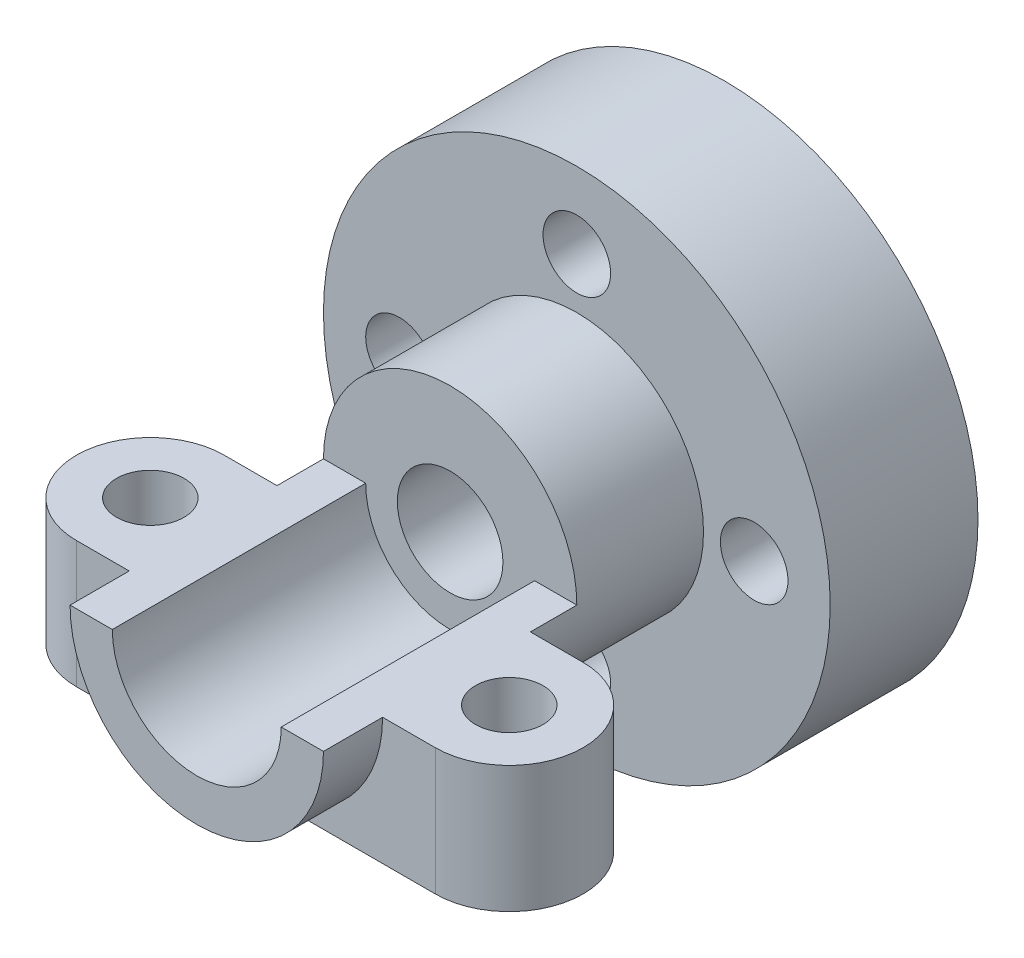
ISO-10303-21;
HEADER;
FILE_DESCRIPTION(('STEP AP214'),'2;1');
FILE_NAME('part.step','',(''),(''),'','','');
FILE_SCHEMA(('AUTOMOTIVE_DESIGN { 1 0 10303 214 1 1 1 1 }'));
ENDSEC;
DATA;
#1=APPLICATION_CONTEXT('core data for automotive mechanical design processes');
#2=APPLICATION_PROTOCOL_DEFINITION('international standard','automotive_design',2000,#1);
#3=PRODUCT_CONTEXT('',#1,'mechanical');
#4=PRODUCT('Part','Part','',(#3));
#5=PRODUCT_RELATED_PRODUCT_CATEGORY('part','',(#4));
#6=PRODUCT_DEFINITION_FORMATION('','',#4);
#7=PRODUCT_DEFINITION_CONTEXT('part definition',#1,'design');
#8=PRODUCT_DEFINITION('design','',#6,#7);
#9=PRODUCT_DEFINITION_SHAPE('','',#8);
#10=(LENGTH_UNIT() NAMED_UNIT(*) SI_UNIT(.MILLI.,.METRE.));
#11=(NAMED_UNIT(*) PLANE_ANGLE_UNIT() SI_UNIT($,.RADIAN.));
#12=(NAMED_UNIT(*) SI_UNIT($,.STERADIAN.) SOLID_ANGLE_UNIT());
#13=UNCERTAINTY_MEASURE_WITH_UNIT(LENGTH_MEASURE(1.E-05),#10,'distance_accuracy_value','');
#14=(GEOMETRIC_REPRESENTATION_CONTEXT(3) GLOBAL_UNCERTAINTY_ASSIGNED_CONTEXT((#13)) GLOBAL_UNIT_ASSIGNED_CONTEXT((#10,
#11,#12)) REPRESENTATION_CONTEXT('',''));
#15=CARTESIAN_POINT('',(0.,0.,0.));
#16=DIRECTION('',(0.,0.,1.));
#17=DIRECTION('',(1.,0.,0.));
#18=AXIS2_PLACEMENT_3D('',#15,#16,#17);
#19=CARTESIAN_POINT('',(0.,0.,65.));
#20=DIRECTION('',(0.,0.,-1.));
#21=DIRECTION('',(-1.,0.,0.));
#22=AXIS2_PLACEMENT_3D('',#19,#20,#21);
#23=CYLINDRICAL_SURFACE('',#22,12.5);
#24=CARTESIAN_POINT('',(0.,0.,65.));
#25=DIRECTION('',(0.,0.,1.));
#26=DIRECTION('',(1.,0.,0.));
#27=AXIS2_PLACEMENT_3D('',#24,#25,#26);
#28=CIRCLE('',#27,12.5);
#29=CARTESIAN_POINT('',(12.5,0.,65.));
#30=VERTEX_POINT('',#29);
#31=EDGE_CURVE('E218',#30,#30,#28,.T.);
#32=ORIENTED_EDGE('',*,*,#31,.T.);
#33=EDGE_LOOP('',(#32));
#34=FACE_BOUND('',#33,.T.);
#35=CARTESIAN_POINT('',(0.,0.,10.));
#36=DIRECTION('',(0.,0.,-1.));
#37=DIRECTION('',(-1.,0.,0.));
#38=AXIS2_PLACEMENT_3D('',#35,#36,#37);
#39=CIRCLE('',#38,12.5);
#40=CARTESIAN_POINT('',(-12.5,0.,10.));
#41=VERTEX_POINT('',#40);
#42=EDGE_CURVE('E308',#41,#41,#39,.T.);
#43=ORIENTED_EDGE('',*,*,#42,.T.);
#44=EDGE_LOOP('',(#43));
#45=FACE_BOUND('',#44,.T.);
#46=ADVANCED_FACE('F41',(#34,#45),#23,.F.);
#47=CARTESIAN_POINT('',(42.,0.,35.));
#48=DIRECTION('',(0.,0.,-1.));
#49=DIRECTION('',(-1.,0.,0.));
#50=AXIS2_PLACEMENT_3D('',#47,#48,#49);
#51=CYLINDRICAL_SURFACE('',#50,7.99999999999999);
#52=CARTESIAN_POINT('',(42.,0.,35.));
#53=DIRECTION('',(0.,0.,1.));
#54=DIRECTION('',(1.,0.,0.));
#55=AXIS2_PLACEMENT_3D('',#52,#53,#54);
#56=CIRCLE('',#55,7.99999999999999);
#57=CARTESIAN_POINT('',(50.,0.,35.));
#58=VERTEX_POINT('',#57);
#59=EDGE_CURVE('E206',#58,#58,#56,.T.);
#60=ORIENTED_EDGE('',*,*,#59,.T.);
#61=EDGE_LOOP('',(#60));
#62=FACE_BOUND('',#61,.T.);
#63=CARTESIAN_POINT('',(42.,0.,10.));
#64=DIRECTION('',(0.,0.,-1.));
#65=DIRECTION('',(-1.,0.,0.));
#66=AXIS2_PLACEMENT_3D('',#63,#64,#65);
#67=CIRCLE('',#66,7.99999999999999);
#68=CARTESIAN_POINT('',(34.,0.,10.));
#69=VERTEX_POINT('',#68);
#70=EDGE_CURVE('E312',#69,#69,#67,.T.);
#71=ORIENTED_EDGE('',*,*,#70,.T.);
#72=EDGE_LOOP('',(#71));
#73=FACE_BOUND('',#72,.T.);
#74=ADVANCED_FACE('F353',(#62,#73),#51,.F.);
#75=CARTESIAN_POINT('',(0.,-42.,35.));
#76=DIRECTION('',(0.,0.,-1.));
#77=DIRECTION('',(-1.,0.,0.));
#78=AXIS2_PLACEMENT_3D('',#75,#76,#77);
#79=CYLINDRICAL_SURFACE('',#78,8.);
#80=CARTESIAN_POINT('',(0.,-42.,35.));
#81=DIRECTION('',(0.,0.,1.));
#82=DIRECTION('',(1.,0.,0.));
#83=AXIS2_PLACEMENT_3D('',#80,#81,#82);
#84=CIRCLE('',#83,8.);
#85=CARTESIAN_POINT('',(8.,-42.,35.));
#86=VERTEX_POINT('',#85);
#87=EDGE_CURVE('E202',#86,#86,#84,.T.);
#88=ORIENTED_EDGE('',*,*,#87,.T.);
#89=EDGE_LOOP('',(#88));
#90=FACE_BOUND('',#89,.T.);
#91=CARTESIAN_POINT('',(0.,-42.,10.));
#92=DIRECTION('',(0.,0.,-1.));
#93=DIRECTION('',(-1.,0.,0.));
#94=AXIS2_PLACEMENT_3D('',#91,#92,#93);
#95=CIRCLE('',#94,8.);
#96=CARTESIAN_POINT('',(-7.99999999999999,-42.,10.));
#97=VERTEX_POINT('',#96);
#98=EDGE_CURVE('E316',#97,#97,#95,.T.);
#99=ORIENTED_EDGE('',*,*,#98,.T.);
#100=EDGE_LOOP('',(#99));
#101=FACE_BOUND('',#100,.T.);
#102=ADVANCED_FACE('F359',(#90,#101),#79,.F.);
#103=CARTESIAN_POINT('',(-42.,0.,35.));
#104=DIRECTION('',(0.,0.,-1.));
#105=DIRECTION('',(-1.,0.,0.));
#106=AXIS2_PLACEMENT_3D('',#103,#104,#105);
#107=CYLINDRICAL_SURFACE('',#106,7.99999999999998);
#108=CARTESIAN_POINT('',(-42.,0.,35.));
#109=DIRECTION('',(0.,0.,1.));
#110=DIRECTION('',(1.,0.,0.));
#111=AXIS2_PLACEMENT_3D('',#108,#109,#110);
#112=CIRCLE('',#111,7.99999999999998);
#113=CARTESIAN_POINT('',(-34.,0.,35.));
#114=VERTEX_POINT('',#113);
#115=EDGE_CURVE('E198',#114,#114,#112,.T.);
#116=ORIENTED_EDGE('',*,*,#115,.T.);
#117=EDGE_LOOP('',(#116));
#118=FACE_BOUND('',#117,.T.);
#119=CARTESIAN_POINT('',(-42.,0.,10.));
#120=DIRECTION('',(0.,0.,-1.));
#121=DIRECTION('',(-1.,0.,0.));
#122=AXIS2_PLACEMENT_3D('',#119,#120,#121);
#123=CIRCLE('',#122,7.99999999999998);
#124=CARTESIAN_POINT('',(-50.,0.,10.));
#125=VERTEX_POINT('',#124);
#126=EDGE_CURVE('E320',#125,#125,#123,.T.);
#127=ORIENTED_EDGE('',*,*,#126,.T.);
#128=EDGE_LOOP('',(#127));
#129=FACE_BOUND('',#128,.T.);
#130=ADVANCED_FACE('F437',(#118,#129),#107,.F.);
#131=CARTESIAN_POINT('',(0.,42.,35.));
#132=DIRECTION('',(0.,0.,-1.));
#133=DIRECTION('',(-1.,0.,0.));
#134=AXIS2_PLACEMENT_3D('',#131,#132,#133);
#135=CYLINDRICAL_SURFACE('',#134,8.);
#136=CARTESIAN_POINT('',(0.,42.,35.));
#137=DIRECTION('',(0.,0.,1.));
#138=DIRECTION('',(1.,0.,0.));
#139=AXIS2_PLACEMENT_3D('',#136,#137,#138);
#140=CIRCLE('',#139,8.);
#141=CARTESIAN_POINT('',(7.99999999999999,42.,35.));
#142=VERTEX_POINT('',#141);
#143=EDGE_CURVE('E194',#142,#142,#140,.T.);
#144=ORIENTED_EDGE('',*,*,#143,.T.);
#145=EDGE_LOOP('',(#144));
#146=FACE_BOUND('',#145,.T.);
#147=CARTESIAN_POINT('',(0.,42.,10.));
#148=DIRECTION('',(0.,0.,-1.));
#149=DIRECTION('',(-1.,0.,0.));
#150=AXIS2_PLACEMENT_3D('',#147,#148,#149);
#151=CIRCLE('',#150,8.);
#152=CARTESIAN_POINT('',(-8.00000000000001,42.,10.));
#153=VERTEX_POINT('',#152);
#154=EDGE_CURVE('E46',#153,#153,#151,.T.);
#155=ORIENTED_EDGE('',*,*,#154,.T.);
#156=EDGE_LOOP('',(#155));
#157=FACE_BOUND('',#156,.T.);
#158=ADVANCED_FACE('F337',(#146,#157),#135,.F.);
#159=CARTESIAN_POINT('',(0.,0.,125.));
#160=DIRECTION('',(0.,-1.,0.));
#161=DIRECTION('',(1.,0.,0.));
#162=AXIS2_PLACEMENT_3D('',#159,#160,#161);
#163=PLANE('',#162);
#164=DIRECTION('',(1.,0.,0.));
#165=VECTOR('',#164,1.);
#166=CARTESIAN_POINT('',(-30.,0.,76.));
#167=LINE('',#166,#165);
#168=CARTESIAN_POINT('',(-42.5,0.,76.));
#169=VERTEX_POINT('',#168);
#170=CARTESIAN_POINT('',(-30.,0.,76.));
#171=VERTEX_POINT('',#170);
#172=EDGE_CURVE('E169',#169,#171,#167,.T.);
#173=ORIENTED_EDGE('',*,*,#172,.F.);
#174=CARTESIAN_POINT('',(-42.5,0.,93.5));
#175=DIRECTION('',(0.,-1.,0.));
#176=DIRECTION('',(1.,0.,0.));
#177=AXIS2_PLACEMENT_3D('',#174,#175,#176);
#178=CIRCLE('',#177,17.5);
#179=CARTESIAN_POINT('',(-42.5,0.,111.));
#180=VERTEX_POINT('',#179);
#181=EDGE_CURVE('E52',#169,#180,#178,.F.);
#182=ORIENTED_EDGE('',*,*,#181,.T.);
#183=DIRECTION('',(1.,0.,0.));
#184=VECTOR('',#183,1.);
#185=CARTESIAN_POINT('',(-30.,0.,111.));
#186=LINE('',#185,#184);
#187=CARTESIAN_POINT('',(-30.,0.,111.));
#188=VERTEX_POINT('',#187);
#189=EDGE_CURVE('E157',#180,#188,#186,.T.);
#190=ORIENTED_EDGE('',*,*,#189,.T.);
#191=DIRECTION('',(0.,0.,-1.));
#192=VECTOR('',#191,1.);
#193=CARTESIAN_POINT('',(-30.,0.,125.));
#194=LINE('',#193,#192);
#195=CARTESIAN_POINT('',(-30.,0.,125.));
#196=VERTEX_POINT('',#195);
#197=EDGE_CURVE('E153',#196,#188,#194,.T.);
#198=ORIENTED_EDGE('',*,*,#197,.F.);
#199=DIRECTION('',(-1.,0.,0.));
#200=VECTOR('',#199,1.);
#201=CARTESIAN_POINT('',(0.,0.,125.));
#202=LINE('',#201,#200);
#203=CARTESIAN_POINT('',(-20.,0.,125.));
#204=VERTEX_POINT('',#203);
#205=EDGE_CURVE('E244',#204,#196,#202,.T.);
#206=ORIENTED_EDGE('',*,*,#205,.F.);
#207=DIRECTION('',(0.,0.,-1.));
#208=VECTOR('',#207,1.);
#209=CARTESIAN_POINT('',(-20.,0.,125.));
#210=LINE('',#209,#208);
#211=CARTESIAN_POINT('',(-20.,0.,65.));
#212=VERTEX_POINT('',#211);
#213=EDGE_CURVE('E265',#204,#212,#210,.T.);
#214=ORIENTED_EDGE('',*,*,#213,.T.);
#215=DIRECTION('',(-1.,0.,0.));
#216=VECTOR('',#215,1.);
#217=CARTESIAN_POINT('',(0.,0.,65.));
#218=LINE('',#217,#216);
#219=CARTESIAN_POINT('',(-30.,0.,65.));
#220=VERTEX_POINT('',#219);
#221=EDGE_CURVE('E225',#212,#220,#218,.T.);
#222=ORIENTED_EDGE('',*,*,#221,.T.);
#223=EDGE_CURVE('E262',#171,#220,#194,.T.);
#224=ORIENTED_EDGE('',*,*,#223,.F.);
#225=EDGE_LOOP('',(#173,#182,#190,#198,#206,#214,#222,#224));
#226=FACE_BOUND('',#225,.T.);
#227=CARTESIAN_POINT('',(-42.5,0.,93.5));
#228=DIRECTION('',(0.,1.,0.));
#229=DIRECTION('',(0.,0.,1.));
#230=AXIS2_PLACEMENT_3D('',#227,#228,#229);
#231=CIRCLE('',#230,7.99999999999999);
#232=CARTESIAN_POINT('',(-42.5,0.,101.5));
#233=VERTEX_POINT('',#232);
#234=EDGE_CURVE('E304',#233,#233,#231,.T.);
#235=ORIENTED_EDGE('',*,*,#234,.F.);
#236=EDGE_LOOP('',(#235));
#237=FACE_BOUND('',#236,.T.);
#238=ADVANCED_FACE('F289',(#226,#237),#163,.F.);
#239=CARTESIAN_POINT('',(-42.5,0.,93.5));
#240=DIRECTION('',(0.,1.,0.));
#241=DIRECTION('',(0.,0.,1.));
#242=AXIS2_PLACEMENT_3D('',#239,#240,#241);
#243=CYLINDRICAL_SURFACE('',#242,17.5);
#244=DIRECTION('',(0.,-1.,0.));
#245=VECTOR('',#244,1.);
#246=CARTESIAN_POINT('',(-42.5,0.,111.));
#247=LINE('',#246,#245);
#248=CARTESIAN_POINT('',(-42.5,-30.,111.));
#249=VERTEX_POINT('',#248);
#250=EDGE_CURVE('E162',#180,#249,#247,.T.);
#251=ORIENTED_EDGE('',*,*,#250,.F.);
#252=ORIENTED_EDGE('',*,*,#181,.F.);
#253=DIRECTION('',(0.,1.,0.));
#254=VECTOR('',#253,1.);
#255=CARTESIAN_POINT('',(-42.5,0.,76.));
#256=LINE('',#255,#254);
#257=CARTESIAN_POINT('',(-42.5,-30.,76.));
#258=VERTEX_POINT('',#257);
#259=EDGE_CURVE('E283',#258,#169,#256,.T.);
#260=ORIENTED_EDGE('',*,*,#259,.F.);
#261=CARTESIAN_POINT('',(-42.5,-30.,93.5));
#262=DIRECTION('',(0.,-1.,0.));
#263=DIRECTION('',(0.,0.,-1.));
#264=AXIS2_PLACEMENT_3D('',#261,#262,#263);
#265=CIRCLE('',#264,17.5);
#266=EDGE_CURVE('E11',#249,#258,#265,.T.);
#267=ORIENTED_EDGE('',*,*,#266,.F.);
#268=EDGE_LOOP('',(#251,#252,#260,#267));
#269=FACE_BOUND('',#268,.T.);
#270=ADVANCED_FACE('F44',(#269),#243,.T.);
#271=CARTESIAN_POINT('',(0.,0.,125.));
#272=DIRECTION('',(0.,0.,-1.));
#273=DIRECTION('',(-1.,0.,0.));
#274=AXIS2_PLACEMENT_3D('',#271,#272,#273);
#275=CYLINDRICAL_SURFACE('',#274,30.);
#276=CARTESIAN_POINT('',(0.,0.,35.));
#277=DIRECTION('',(0.,0.,1.));
#278=DIRECTION('',(1.,0.,0.));
#279=AXIS2_PLACEMENT_3D('',#276,#277,#278);
#280=CIRCLE('',#279,30.);
#281=CARTESIAN_POINT('',(30.,0.,35.));
#282=VERTEX_POINT('',#281);
#283=EDGE_CURVE('E210',#282,#282,#280,.T.);
#284=ORIENTED_EDGE('',*,*,#283,.T.);
#285=EDGE_LOOP('',(#284));
#286=FACE_BOUND('',#285,.T.);
#287=CARTESIAN_POINT('',(0.,0.,76.));
#288=DIRECTION('',(0.,0.,1.));
#289=DIRECTION('',(-1.,0.,0.));
#290=AXIS2_PLACEMENT_3D('',#287,#288,#289);
#291=CIRCLE('',#290,30.);
#292=CARTESIAN_POINT('',(0.,-30.,76.));
#293=VERTEX_POINT('',#292);
#294=EDGE_CURVE('E164',#171,#293,#291,.T.);
#295=ORIENTED_EDGE('',*,*,#294,.F.);
#296=ORIENTED_EDGE('',*,*,#223,.T.);
#297=CARTESIAN_POINT('',(0.,0.,65.));
#298=DIRECTION('',(0.,0.,1.));
#299=DIRECTION('',(1.,0.,0.));
#300=AXIS2_PLACEMENT_3D('',#297,#298,#299);
#301=CIRCLE('',#300,30.);
#302=CARTESIAN_POINT('',(30.,0.,65.));
#303=VERTEX_POINT('',#302);
#304=EDGE_CURVE('E236',#303,#220,#301,.T.);
#305=ORIENTED_EDGE('',*,*,#304,.F.);
#306=DIRECTION('',(0.,0.,-1.));
#307=VECTOR('',#306,1.);
#308=CARTESIAN_POINT('',(30.,0.,125.));
#309=LINE('',#308,#307);
#310=CARTESIAN_POINT('',(30.,0.,76.));
#311=VERTEX_POINT('',#310);
#312=EDGE_CURVE('E258',#311,#303,#309,.T.);
#313=ORIENTED_EDGE('',*,*,#312,.F.);
#314=CARTESIAN_POINT('',(0.,0.,76.));
#315=DIRECTION('',(0.,0.,-1.));
#316=DIRECTION('',(1.,0.,0.));
#317=AXIS2_PLACEMENT_3D('',#314,#315,#316);
#318=CIRCLE('',#317,30.);
#319=EDGE_CURVE('E181',#311,#293,#318,.T.);
#320=ORIENTED_EDGE('',*,*,#319,.T.);
#321=EDGE_LOOP('',(#295,#296,#305,#313,#320));
#322=FACE_BOUND('',#321,.T.);
#323=ADVANCED_FACE('F383',(#286,#322),#275,.T.);
#324=CARTESIAN_POINT('',(42.5,-30.,93.5));
#325=DIRECTION('',(0.,1.,0.));
#326=DIRECTION('',(0.,0.,1.));
#327=AXIS2_PLACEMENT_3D('',#324,#325,#326);
#328=CYLINDRICAL_SURFACE('',#327,17.5);
#329=DIRECTION('',(0.,1.,0.));
#330=VECTOR('',#329,1.);
#331=CARTESIAN_POINT('',(42.5,0.,111.));
#332=LINE('',#331,#330);
#333=CARTESIAN_POINT('',(42.5,-30.,111.));
#334=VERTEX_POINT('',#333);
#335=CARTESIAN_POINT('',(42.5,0.,111.));
#336=VERTEX_POINT('',#335);
#337=EDGE_CURVE('E269',#334,#336,#332,.T.);
#338=ORIENTED_EDGE('',*,*,#337,.F.);
#339=CARTESIAN_POINT('',(42.5,-30.,93.5));
#340=DIRECTION('',(0.,-1.,0.));
#341=DIRECTION('',(0.,0.,-1.));
#342=AXIS2_PLACEMENT_3D('',#339,#340,#341);
#343=CIRCLE('',#342,17.5);
#344=CARTESIAN_POINT('',(42.5,-30.,76.));
#345=VERTEX_POINT('',#344);
#346=EDGE_CURVE('E143',#345,#334,#343,.T.);
#347=ORIENTED_EDGE('',*,*,#346,.F.);
#348=DIRECTION('',(0.,-1.,0.));
#349=VECTOR('',#348,1.);
#350=CARTESIAN_POINT('',(42.5,-30.,76.));
#351=LINE('',#350,#349);
#352=CARTESIAN_POINT('',(42.5,0.,76.));
#353=VERTEX_POINT('',#352);
#354=EDGE_CURVE('E272',#353,#345,#351,.T.);
#355=ORIENTED_EDGE('',*,*,#354,.F.);
#356=CARTESIAN_POINT('',(42.5,0.,93.5));
#357=DIRECTION('',(0.,1.,0.));
#358=DIRECTION('',(-1.,0.,0.));
#359=AXIS2_PLACEMENT_3D('',#356,#357,#358);
#360=CIRCLE('',#359,17.5);
#361=EDGE_CURVE('E278',#336,#353,#360,.T.);
#362=ORIENTED_EDGE('',*,*,#361,.F.);
#363=EDGE_LOOP('',(#338,#347,#355,#362));
#364=FACE_BOUND('',#363,.T.);
#365=ADVANCED_FACE('F382',(#364),#328,.T.);
#366=ORIENTED_EDGE('',*,*,#197,.T.);
#367=CARTESIAN_POINT('',(0.,0.,111.));
#368=DIRECTION('',(0.,0.,1.));
#369=DIRECTION('',(-1.,0.,0.));
#370=AXIS2_PLACEMENT_3D('',#367,#368,#369);
#371=CIRCLE('',#370,30.);
#372=CARTESIAN_POINT('',(0.,-30.,111.));
#373=VERTEX_POINT('',#372);
#374=EDGE_CURVE('E149',#188,#373,#371,.T.);
#375=ORIENTED_EDGE('',*,*,#374,.T.);
#376=CARTESIAN_POINT('',(0.,0.,111.));
#377=DIRECTION('',(0.,0.,-1.));
#378=DIRECTION('',(1.,0.,0.));
#379=AXIS2_PLACEMENT_3D('',#376,#377,#378);
#380=CIRCLE('',#379,30.);
#381=CARTESIAN_POINT('',(30.,0.,111.));
#382=VERTEX_POINT('',#381);
#383=EDGE_CURVE('E125',#382,#373,#380,.T.);
#384=ORIENTED_EDGE('',*,*,#383,.F.);
#385=CARTESIAN_POINT('',(30.,0.,125.));
#386=VERTEX_POINT('',#385);
#387=EDGE_CURVE('E259',#386,#382,#309,.T.);
#388=ORIENTED_EDGE('',*,*,#387,.F.);
#389=CARTESIAN_POINT('',(0.,0.,125.));
#390=DIRECTION('',(0.,0.,1.));
#391=DIRECTION('',(1.,0.,0.));
#392=AXIS2_PLACEMENT_3D('',#389,#390,#391);
#393=CIRCLE('',#392,30.);
#394=EDGE_CURVE('E247',#196,#386,#393,.T.);
#395=ORIENTED_EDGE('',*,*,#394,.F.);
#396=EDGE_LOOP('',(#366,#375,#384,#388,#395));
#397=FACE_BOUND('',#396,.T.);
#398=ADVANCED_FACE('F150',(#397),#275,.T.);
#399=CARTESIAN_POINT('',(0.,0.,125.));
#400=DIRECTION('',(0.,0.,-1.));
#401=DIRECTION('',(-1.,0.,0.));
#402=AXIS2_PLACEMENT_3D('',#399,#400,#401);
#403=CYLINDRICAL_SURFACE('',#402,20.);
#404=CARTESIAN_POINT('',(0.,0.,65.));
#405=DIRECTION('',(0.,0.,1.));
#406=DIRECTION('',(1.,0.,0.));
#407=AXIS2_PLACEMENT_3D('',#404,#405,#406);
#408=CIRCLE('',#407,20.);
#409=CARTESIAN_POINT('',(20.,0.,65.));
#410=VERTEX_POINT('',#409);
#411=EDGE_CURVE('E229',#212,#410,#408,.T.);
#412=ORIENTED_EDGE('',*,*,#411,.F.);
#413=ORIENTED_EDGE('',*,*,#213,.F.);
#414=CARTESIAN_POINT('',(0.,0.,125.));
#415=DIRECTION('',(0.,0.,1.));
#416=DIRECTION('',(1.,0.,0.));
#417=AXIS2_PLACEMENT_3D('',#414,#415,#416);
#418=CIRCLE('',#417,20.);
#419=CARTESIAN_POINT('',(20.,0.,125.));
#420=VERTEX_POINT('',#419);
#421=EDGE_CURVE('E240',#204,#420,#418,.T.);
#422=ORIENTED_EDGE('',*,*,#421,.T.);
#423=DIRECTION('',(0.,0.,-1.));
#424=VECTOR('',#423,1.);
#425=CARTESIAN_POINT('',(20.,0.,125.));
#426=LINE('',#425,#424);
#427=EDGE_CURVE('E254',#420,#410,#426,.T.);
#428=ORIENTED_EDGE('',*,*,#427,.T.);
#429=EDGE_LOOP('',(#412,#413,#422,#428));
#430=FACE_BOUND('',#429,.T.);
#431=ADVANCED_FACE('F378',(#430),#403,.F.);
#432=CARTESIAN_POINT('',(0.,0.,125.));
#433=DIRECTION('',(0.,1.,0.));
#434=DIRECTION('',(-1.,0.,0.));
#435=AXIS2_PLACEMENT_3D('',#432,#433,#434);
#436=PLANE('',#435);
#437=CARTESIAN_POINT('',(42.5,0.,93.5));
#438=DIRECTION('',(0.,1.,0.));
#439=DIRECTION('',(0.,0.,1.));
#440=AXIS2_PLACEMENT_3D('',#437,#438,#439);
#441=CIRCLE('',#440,7.99999999999999);
#442=CARTESIAN_POINT('',(42.5,0.,101.5));
#443=VERTEX_POINT('',#442);
#444=EDGE_CURVE('E173',#443,#443,#441,.T.);
#445=ORIENTED_EDGE('',*,*,#444,.F.);
#446=EDGE_LOOP('',(#445));
#447=FACE_BOUND('',#446,.T.);
#448=DIRECTION('',(-1.,0.,0.));
#449=VECTOR('',#448,1.);
#450=CARTESIAN_POINT('',(30.,0.,111.));
#451=LINE('',#450,#449);
#452=EDGE_CURVE('E131',#336,#382,#451,.T.);
#453=ORIENTED_EDGE('',*,*,#452,.F.);
#454=ORIENTED_EDGE('',*,*,#361,.T.);
#455=DIRECTION('',(-1.,0.,0.));
#456=VECTOR('',#455,1.);
#457=CARTESIAN_POINT('',(30.,0.,76.));
#458=LINE('',#457,#456);
#459=EDGE_CURVE('E188',#353,#311,#458,.T.);
#460=ORIENTED_EDGE('',*,*,#459,.T.);
#461=ORIENTED_EDGE('',*,*,#312,.T.);
#462=DIRECTION('',(1.,0.,0.));
#463=VECTOR('',#462,1.);
#464=CARTESIAN_POINT('',(0.,0.,65.));
#465=LINE('',#464,#463);
#466=EDGE_CURVE('E232',#410,#303,#465,.T.);
#467=ORIENTED_EDGE('',*,*,#466,.F.);
#468=ORIENTED_EDGE('',*,*,#427,.F.);
#469=DIRECTION('',(1.,0.,0.));
#470=VECTOR('',#469,1.);
#471=CARTESIAN_POINT('',(0.,0.,125.));
#472=LINE('',#471,#470);
#473=EDGE_CURVE('E250',#420,#386,#472,.T.);
#474=ORIENTED_EDGE('',*,*,#473,.T.);
#475=ORIENTED_EDGE('',*,*,#387,.T.);
#476=EDGE_LOOP('',(#453,#454,#460,#461,#467,#468,#474,#475));
#477=FACE_BOUND('',#476,.T.);
#478=ADVANCED_FACE('F371',(#447,#477),#436,.T.);
#479=CARTESIAN_POINT('',(0.,0.,125.));
#480=DIRECTION('',(0.,0.,1.));
#481=DIRECTION('',(1.,0.,0.));
#482=AXIS2_PLACEMENT_3D('',#479,#480,#481);
#483=PLANE('',#482);
#484=ORIENTED_EDGE('',*,*,#421,.F.);
#485=ORIENTED_EDGE('',*,*,#205,.T.);
#486=ORIENTED_EDGE('',*,*,#394,.T.);
#487=ORIENTED_EDGE('',*,*,#473,.F.);
#488=EDGE_LOOP('',(#484,#485,#486,#487));
#489=FACE_BOUND('',#488,.T.);
#490=ADVANCED_FACE('F367',(#489),#483,.T.);
#491=CARTESIAN_POINT('',(0.,0.,0.));
#492=DIRECTION('',(0.,0.,1.));
#493=DIRECTION('',(1.,0.,0.));
#494=AXIS2_PLACEMENT_3D('',#491,#492,#493);
#495=PLANE('',#494);
#496=CARTESIAN_POINT('',(0.,0.,0.));
#497=DIRECTION('',(0.,0.,-1.));
#498=DIRECTION('',(-1.,0.,0.));
#499=AXIS2_PLACEMENT_3D('',#496,#497,#498);
#500=CIRCLE('',#499,53.7903773295249);
#501=CARTESIAN_POINT('',(-53.7903773295249,0.,0.));
#502=VERTEX_POINT('',#501);
#503=EDGE_CURVE('E324',#502,#502,#500,.T.);
#504=ORIENTED_EDGE('',*,*,#503,.F.);
#505=EDGE_LOOP('',(#504));
#506=FACE_BOUND('',#505,.T.);
#507=CARTESIAN_POINT('',(0.,0.,0.));
#508=DIRECTION('',(0.,0.,1.));
#509=DIRECTION('',(1.,0.,0.));
#510=AXIS2_PLACEMENT_3D('',#507,#508,#509);
#511=CIRCLE('',#510,60.);
#512=CARTESIAN_POINT('',(60.,0.,0.));
#513=VERTEX_POINT('',#512);
#514=EDGE_CURVE('E190',#513,#513,#511,.T.);
#515=ORIENTED_EDGE('',*,*,#514,.F.);
#516=EDGE_LOOP('',(#515));
#517=FACE_BOUND('',#516,.T.);
#518=ADVANCED_FACE('F370',(#506,#517),#495,.F.);
#519=CARTESIAN_POINT('',(0.,0.,65.));
#520=DIRECTION('',(0.,0.,1.));
#521=DIRECTION('',(1.,0.,0.));
#522=AXIS2_PLACEMENT_3D('',#519,#520,#521);
#523=PLANE('',#522);
#524=ORIENTED_EDGE('',*,*,#31,.F.);
#525=EDGE_LOOP('',(#524));
#526=FACE_BOUND('',#525,.T.);
#527=ORIENTED_EDGE('',*,*,#221,.F.);
#528=ORIENTED_EDGE('',*,*,#411,.T.);
#529=ORIENTED_EDGE('',*,*,#466,.T.);
#530=ORIENTED_EDGE('',*,*,#304,.T.);
#531=EDGE_LOOP('',(#527,#528,#529,#530));
#532=FACE_BOUND('',#531,.T.);
#533=ADVANCED_FACE('F365',(#526,#532),#523,.T.);
#534=CARTESIAN_POINT('',(0.,0.,35.));
#535=DIRECTION('',(0.,0.,-1.));
#536=DIRECTION('',(-1.,0.,0.));
#537=AXIS2_PLACEMENT_3D('',#534,#535,#536);
#538=CYLINDRICAL_SURFACE('',#537,60.);
#539=CARTESIAN_POINT('',(0.,0.,35.));
#540=DIRECTION('',(0.,0.,1.));
#541=DIRECTION('',(1.,0.,0.));
#542=AXIS2_PLACEMENT_3D('',#539,#540,#541);
#543=CIRCLE('',#542,60.);
#544=CARTESIAN_POINT('',(60.,0.,35.));
#545=VERTEX_POINT('',#544);
#546=EDGE_CURVE('E214',#545,#545,#543,.T.);
#547=ORIENTED_EDGE('',*,*,#546,.F.);
#548=EDGE_LOOP('',(#547));
#549=FACE_BOUND('',#548,.T.);
#550=ORIENTED_EDGE('',*,*,#514,.T.);
#551=EDGE_LOOP('',(#550));
#552=FACE_BOUND('',#551,.T.);
#553=ADVANCED_FACE('F430',(#549,#552),#538,.T.);
#554=CARTESIAN_POINT('',(0.,0.,35.));
#555=DIRECTION('',(0.,0.,1.));
#556=DIRECTION('',(1.,0.,0.));
#557=AXIS2_PLACEMENT_3D('',#554,#555,#556);
#558=PLANE('',#557);
#559=ORIENTED_EDGE('',*,*,#143,.F.);
#560=EDGE_LOOP('',(#559));
#561=FACE_BOUND('',#560,.T.);
#562=ORIENTED_EDGE('',*,*,#115,.F.);
#563=EDGE_LOOP('',(#562));
#564=FACE_BOUND('',#563,.T.);
#565=ORIENTED_EDGE('',*,*,#87,.F.);
#566=EDGE_LOOP('',(#565));
#567=FACE_BOUND('',#566,.T.);
#568=ORIENTED_EDGE('',*,*,#59,.F.);
#569=EDGE_LOOP('',(#568));
#570=FACE_BOUND('',#569,.T.);
#571=ORIENTED_EDGE('',*,*,#283,.F.);
#572=EDGE_LOOP('',(#571));
#573=FACE_BOUND('',#572,.T.);
#574=ORIENTED_EDGE('',*,*,#546,.T.);
#575=EDGE_LOOP('',(#574));
#576=FACE_BOUND('',#575,.T.);
#577=ADVANCED_FACE('F422',(#561,#564,#567,#570,#573,#576),#558,.T.);
#578=CARTESIAN_POINT('',(0.,-30.,76.));
#579=DIRECTION('',(0.,-1.,0.));
#580=DIRECTION('',(0.,0.,-1.));
#581=AXIS2_PLACEMENT_3D('',#578,#579,#580);
#582=PLANE('',#581);
#583=CARTESIAN_POINT('',(-42.5,-30.,93.5));
#584=DIRECTION('',(0.,-1.,0.));
#585=DIRECTION('',(0.,0.,-1.));
#586=AXIS2_PLACEMENT_3D('',#583,#584,#585);
#587=CIRCLE('',#586,7.99999999999999);
#588=CARTESIAN_POINT('',(-42.5,-30.,85.5));
#589=VERTEX_POINT('',#588);
#590=EDGE_CURVE('E158',#589,#589,#587,.T.);
#591=ORIENTED_EDGE('',*,*,#590,.F.);
#592=EDGE_LOOP('',(#591));
#593=FACE_BOUND('',#592,.T.);
#594=CARTESIAN_POINT('',(42.5,-30.,93.5));
#595=DIRECTION('',(0.,-1.,0.));
#596=DIRECTION('',(0.,0.,-1.));
#597=AXIS2_PLACEMENT_3D('',#594,#595,#596);
#598=CIRCLE('',#597,7.99999999999999);
#599=CARTESIAN_POINT('',(42.5,-30.,85.5));
#600=VERTEX_POINT('',#599);
#601=EDGE_CURVE('E137',#600,#600,#598,.T.);
#602=ORIENTED_EDGE('',*,*,#601,.F.);
#603=EDGE_LOOP('',(#602));
#604=FACE_BOUND('',#603,.T.);
#605=DIRECTION('',(-1.,0.,0.));
#606=VECTOR('',#605,1.);
#607=CARTESIAN_POINT('',(0.,-30.,111.));
#608=LINE('',#607,#606);
#609=EDGE_CURVE('E141',#373,#249,#608,.T.);
#610=ORIENTED_EDGE('',*,*,#609,.T.);
#611=ORIENTED_EDGE('',*,*,#266,.T.);
#612=DIRECTION('',(-1.,0.,0.));
#613=VECTOR('',#612,1.);
#614=CARTESIAN_POINT('',(0.,-30.,76.));
#615=LINE('',#614,#613);
#616=EDGE_CURVE('E177',#293,#258,#615,.T.);
#617=ORIENTED_EDGE('',*,*,#616,.F.);
#618=DIRECTION('',(1.,0.,0.));
#619=VECTOR('',#618,1.);
#620=CARTESIAN_POINT('',(0.,-30.,76.));
#621=LINE('',#620,#619);
#622=EDGE_CURVE('E185',#293,#345,#621,.T.);
#623=ORIENTED_EDGE('',*,*,#622,.T.);
#624=ORIENTED_EDGE('',*,*,#346,.T.);
#625=DIRECTION('',(1.,0.,0.));
#626=VECTOR('',#625,1.);
#627=CARTESIAN_POINT('',(0.,-30.,111.));
#628=LINE('',#627,#626);
#629=EDGE_CURVE('E129',#373,#334,#628,.T.);
#630=ORIENTED_EDGE('',*,*,#629,.F.);
#631=EDGE_LOOP('',(#610,#611,#617,#623,#624,#630));
#632=FACE_BOUND('',#631,.T.);
#633=ADVANCED_FACE('F139',(#593,#604,#632),#582,.T.);
#634=CARTESIAN_POINT('',(0.,0.,76.));
#635=DIRECTION('',(0.,0.,1.));
#636=DIRECTION('',(1.,0.,0.));
#637=AXIS2_PLACEMENT_3D('',#634,#635,#636);
#638=PLANE('',#637);
#639=ORIENTED_EDGE('',*,*,#459,.F.);
#640=ORIENTED_EDGE('',*,*,#354,.T.);
#641=ORIENTED_EDGE('',*,*,#622,.F.);
#642=ORIENTED_EDGE('',*,*,#319,.F.);
#643=EDGE_LOOP('',(#639,#640,#641,#642));
#644=FACE_BOUND('',#643,.T.);
#645=ADVANCED_FACE('F413',(#644),#638,.F.);
#646=CARTESIAN_POINT('',(0.,0.,111.));
#647=DIRECTION('',(0.,0.,1.));
#648=DIRECTION('',(1.,0.,0.));
#649=AXIS2_PLACEMENT_3D('',#646,#647,#648);
#650=PLANE('',#649);
#651=ORIENTED_EDGE('',*,*,#629,.T.);
#652=ORIENTED_EDGE('',*,*,#337,.T.);
#653=ORIENTED_EDGE('',*,*,#452,.T.);
#654=ORIENTED_EDGE('',*,*,#383,.T.);
#655=EDGE_LOOP('',(#651,#652,#653,#654));
#656=FACE_BOUND('',#655,.T.);
#657=ADVANCED_FACE('F127',(#656),#650,.T.);
#658=CARTESIAN_POINT('',(42.5,0.,93.5));
#659=DIRECTION('',(0.,1.,0.));
#660=DIRECTION('',(0.,0.,1.));
#661=AXIS2_PLACEMENT_3D('',#658,#659,#660);
#662=CYLINDRICAL_SURFACE('',#661,7.99999999999999);
#663=ORIENTED_EDGE('',*,*,#444,.T.);
#664=EDGE_LOOP('',(#663));
#665=FACE_BOUND('',#664,.T.);
#666=ORIENTED_EDGE('',*,*,#601,.T.);
#667=EDGE_LOOP('',(#666));
#668=FACE_BOUND('',#667,.T.);
#669=ADVANCED_FACE('F420',(#665,#668),#662,.F.);
#670=CARTESIAN_POINT('',(0.,0.,76.));
#671=DIRECTION('',(0.,0.,1.));
#672=DIRECTION('',(-1.,0.,0.));
#673=AXIS2_PLACEMENT_3D('',#670,#671,#672);
#674=PLANE('',#673);
#675=ORIENTED_EDGE('',*,*,#616,.T.);
#676=ORIENTED_EDGE('',*,*,#259,.T.);
#677=ORIENTED_EDGE('',*,*,#172,.T.);
#678=ORIENTED_EDGE('',*,*,#294,.T.);
#679=EDGE_LOOP('',(#675,#676,#677,#678));
#680=FACE_BOUND('',#679,.T.);
#681=ADVANCED_FACE('F294',(#680),#674,.F.);
#682=CARTESIAN_POINT('',(0.,0.,111.));
#683=DIRECTION('',(0.,0.,1.));
#684=DIRECTION('',(-1.,0.,0.));
#685=AXIS2_PLACEMENT_3D('',#682,#683,#684);
#686=PLANE('',#685);
#687=ORIENTED_EDGE('',*,*,#189,.F.);
#688=ORIENTED_EDGE('',*,*,#250,.T.);
#689=ORIENTED_EDGE('',*,*,#609,.F.);
#690=ORIENTED_EDGE('',*,*,#374,.F.);
#691=EDGE_LOOP('',(#687,#688,#689,#690));
#692=FACE_BOUND('',#691,.T.);
#693=ADVANCED_FACE('F161',(#692),#686,.T.);
#694=CARTESIAN_POINT('',(-42.5,0.,93.5));
#695=DIRECTION('',(0.,1.,0.));
#696=DIRECTION('',(0.,0.,1.));
#697=AXIS2_PLACEMENT_3D('',#694,#695,#696);
#698=CYLINDRICAL_SURFACE('',#697,7.99999999999999);
#699=ORIENTED_EDGE('',*,*,#234,.T.);
#700=EDGE_LOOP('',(#699));
#701=FACE_BOUND('',#700,.T.);
#702=ORIENTED_EDGE('',*,*,#590,.T.);
#703=EDGE_LOOP('',(#702));
#704=FACE_BOUND('',#703,.T.);
#705=ADVANCED_FACE('F347',(#701,#704),#698,.F.);
#706=CARTESIAN_POINT('',(0.,0.,10.));
#707=DIRECTION('',(0.,0.,-1.));
#708=DIRECTION('',(-1.,0.,0.));
#709=AXIS2_PLACEMENT_3D('',#706,#707,#708);
#710=CYLINDRICAL_SURFACE('',#709,53.7903773295249);
#711=CARTESIAN_POINT('',(0.,0.,10.));
#712=DIRECTION('',(0.,0.,-1.));
#713=DIRECTION('',(-1.,0.,0.));
#714=AXIS2_PLACEMENT_3D('',#711,#712,#713);
#715=CIRCLE('',#714,53.7903773295249);
#716=CARTESIAN_POINT('',(-53.7903773295249,0.,10.));
#717=VERTEX_POINT('',#716);
#718=EDGE_CURVE('E328',#717,#717,#715,.T.);
#719=ORIENTED_EDGE('',*,*,#718,.F.);
#720=EDGE_LOOP('',(#719));
#721=FACE_BOUND('',#720,.T.);
#722=ORIENTED_EDGE('',*,*,#503,.T.);
#723=EDGE_LOOP('',(#722));
#724=FACE_BOUND('',#723,.T.);
#725=ADVANCED_FACE('F341',(#721,#724),#710,.F.);
#726=CARTESIAN_POINT('',(0.,0.,10.));
#727=DIRECTION('',(0.,0.,-1.));
#728=DIRECTION('',(-1.,0.,0.));
#729=AXIS2_PLACEMENT_3D('',#726,#727,#728);
#730=PLANE('',#729);
#731=ORIENTED_EDGE('',*,*,#42,.F.);
#732=EDGE_LOOP('',(#731));
#733=FACE_BOUND('',#732,.T.);
#734=ORIENTED_EDGE('',*,*,#70,.F.);
#735=EDGE_LOOP('',(#734));
#736=FACE_BOUND('',#735,.T.);
#737=ORIENTED_EDGE('',*,*,#98,.F.);
#738=EDGE_LOOP('',(#737));
#739=FACE_BOUND('',#738,.T.);
#740=ORIENTED_EDGE('',*,*,#126,.F.);
#741=EDGE_LOOP('',(#740));
#742=FACE_BOUND('',#741,.T.);
#743=ORIENTED_EDGE('',*,*,#154,.F.);
#744=EDGE_LOOP('',(#743));
#745=FACE_BOUND('',#744,.T.);
#746=ORIENTED_EDGE('',*,*,#718,.T.);
#747=EDGE_LOOP('',(#746));
#748=FACE_BOUND('',#747,.T.);
#749=ADVANCED_FACE('F339',(#733,#736,#739,#742,#745,#748),#730,.T.);
#750=CLOSED_SHELL('',(#46,#74,#102,#130,#158,#238,#270,#323,#365,#398,#431,#478,#490,#518,#533,
#553,#577,#633,#645,#657,#669,#681,#693,#705,#725,#749));
#751=MANIFOLD_SOLID_BREP('B2',#750);
#752=ADVANCED_BREP_SHAPE_REPRESENTATION('',(#18,#751),#14);
#753=SHAPE_DEFINITION_REPRESENTATION(#9,#752);
ENDSEC;
END-ISO-10303-21;
